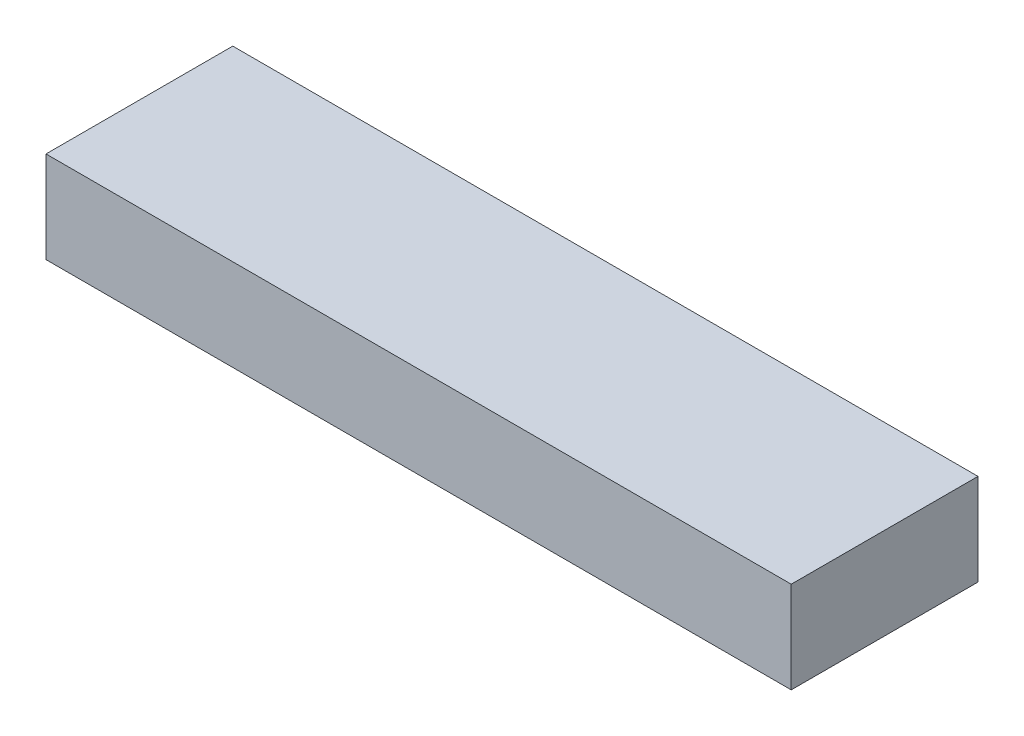
ISO-10303-21;
HEADER;
FILE_DESCRIPTION(('STEP AP214'),'2;1');
FILE_NAME('part.step','',(''),(''),'','','');
FILE_SCHEMA(('AUTOMOTIVE_DESIGN { 1 0 10303 214 1 1 1 1 }'));
ENDSEC;
DATA;
#1=APPLICATION_CONTEXT('core data for automotive mechanical design processes');
#2=APPLICATION_PROTOCOL_DEFINITION('international standard','automotive_design',2000,#1);
#3=PRODUCT_CONTEXT('',#1,'mechanical');
#4=PRODUCT('Part','Part','',(#3));
#5=PRODUCT_RELATED_PRODUCT_CATEGORY('part','',(#4));
#6=PRODUCT_DEFINITION_FORMATION('','',#4);
#7=PRODUCT_DEFINITION_CONTEXT('part definition',#1,'design');
#8=PRODUCT_DEFINITION('design','',#6,#7);
#9=PRODUCT_DEFINITION_SHAPE('','',#8);
#10=(LENGTH_UNIT() NAMED_UNIT(*) SI_UNIT(.MILLI.,.METRE.));
#11=(NAMED_UNIT(*) PLANE_ANGLE_UNIT() SI_UNIT($,.RADIAN.));
#12=(NAMED_UNIT(*) SI_UNIT($,.STERADIAN.) SOLID_ANGLE_UNIT());
#13=UNCERTAINTY_MEASURE_WITH_UNIT(LENGTH_MEASURE(1.E-05),#10,'distance_accuracy_value','');
#14=(GEOMETRIC_REPRESENTATION_CONTEXT(3) GLOBAL_UNCERTAINTY_ASSIGNED_CONTEXT((#13)) GLOBAL_UNIT_ASSIGNED_CONTEXT((#10,
#11,#12)) REPRESENTATION_CONTEXT('',''));
#15=CARTESIAN_POINT('',(0.,0.,0.));
#16=DIRECTION('',(0.,0.,1.));
#17=DIRECTION('',(1.,0.,0.));
#18=AXIS2_PLACEMENT_3D('',#15,#16,#17);
#19=CARTESIAN_POINT('',(8.89,0.,5.08));
#20=DIRECTION('',(0.,0.,-1.));
#21=DIRECTION('',(-1.,0.,0.));
#22=AXIS2_PLACEMENT_3D('',#19,#20,#21);
#23=PLANE('',#22);
#24=DIRECTION('',(0.,1.,0.));
#25=VECTOR('',#24,1.);
#26=CARTESIAN_POINT('',(-1.245,-1.245,5.08));
#27=LINE('',#26,#25);
#28=CARTESIAN_POINT('',(-1.245,-1.245,5.08));
#29=VERTEX_POINT('',#28);
#30=CARTESIAN_POINT('',(-1.245,1.245,5.08));
#31=VERTEX_POINT('',#30);
#32=EDGE_CURVE('E26',#29,#31,#27,.T.);
#33=ORIENTED_EDGE('',*,*,#32,.F.);
#34=DIRECTION('',(-1.,0.,0.));
#35=VECTOR('',#34,1.);
#36=CARTESIAN_POINT('',(19.025,-1.245,5.08));
#37=LINE('',#36,#35);
#38=CARTESIAN_POINT('',(19.025,-1.245,5.08));
#39=VERTEX_POINT('',#38);
#40=EDGE_CURVE('E55',#39,#29,#37,.T.);
#41=ORIENTED_EDGE('',*,*,#40,.F.);
#42=DIRECTION('',(0.,-1.,0.));
#43=VECTOR('',#42,1.);
#44=CARTESIAN_POINT('',(19.025,1.245,5.08));
#45=LINE('',#44,#43);
#46=CARTESIAN_POINT('',(19.025,1.245,5.08));
#47=VERTEX_POINT('',#46);
#48=EDGE_CURVE('E85',#47,#39,#45,.T.);
#49=ORIENTED_EDGE('',*,*,#48,.F.);
#50=DIRECTION('',(1.,0.,0.));
#51=VECTOR('',#50,1.);
#52=CARTESIAN_POINT('',(-1.245,1.245,5.08));
#53=LINE('',#52,#51);
#54=EDGE_CURVE('E83',#31,#47,#53,.T.);
#55=ORIENTED_EDGE('',*,*,#54,.F.);
#56=EDGE_LOOP('',(#33,#41,#49,#55));
#57=FACE_BOUND('',#56,.T.);
#58=ADVANCED_FACE('F16',(#57),#23,.F.);
#59=CARTESIAN_POINT('',(8.89,0.,0.));
#60=DIRECTION('',(0.,0.,-1.));
#61=DIRECTION('',(-1.,0.,0.));
#62=AXIS2_PLACEMENT_3D('',#59,#60,#61);
#63=PLANE('',#62);
#64=DIRECTION('',(1.,0.,0.));
#65=VECTOR('',#64,1.);
#66=CARTESIAN_POINT('',(-1.245,1.245,0.));
#67=LINE('',#66,#65);
#68=CARTESIAN_POINT('',(-1.245,1.245,0.));
#69=VERTEX_POINT('',#68);
#70=CARTESIAN_POINT('',(19.025,1.245,0.));
#71=VERTEX_POINT('',#70);
#72=EDGE_CURVE('E93',#69,#71,#67,.T.);
#73=ORIENTED_EDGE('',*,*,#72,.T.);
#74=DIRECTION('',(0.,-1.,0.));
#75=VECTOR('',#74,1.);
#76=CARTESIAN_POINT('',(19.025,1.245,0.));
#77=LINE('',#76,#75);
#78=CARTESIAN_POINT('',(19.025,-1.245,0.));
#79=VERTEX_POINT('',#78);
#80=EDGE_CURVE('E69',#71,#79,#77,.T.);
#81=ORIENTED_EDGE('',*,*,#80,.T.);
#82=DIRECTION('',(-1.,0.,0.));
#83=VECTOR('',#82,1.);
#84=CARTESIAN_POINT('',(19.025,-1.245,0.));
#85=LINE('',#84,#83);
#86=CARTESIAN_POINT('',(-1.245,-1.245,0.));
#87=VERTEX_POINT('',#86);
#88=EDGE_CURVE('E80',#79,#87,#85,.T.);
#89=ORIENTED_EDGE('',*,*,#88,.T.);
#90=DIRECTION('',(0.,1.,0.));
#91=VECTOR('',#90,1.);
#92=CARTESIAN_POINT('',(-1.245,-1.245,0.));
#93=LINE('',#92,#91);
#94=EDGE_CURVE('E11',#87,#69,#93,.T.);
#95=ORIENTED_EDGE('',*,*,#94,.T.);
#96=EDGE_LOOP('',(#73,#81,#89,#95));
#97=FACE_BOUND('',#96,.T.);
#98=ADVANCED_FACE('F187',(#97),#63,.T.);
#99=CARTESIAN_POINT('',(-1.245,-1.245,0.));
#100=DIRECTION('',(-1.,0.,0.));
#101=DIRECTION('',(0.,0.,1.));
#102=AXIS2_PLACEMENT_3D('',#99,#100,#101);
#103=PLANE('',#102);
#104=DIRECTION('',(0.,0.,1.));
#105=VECTOR('',#104,1.);
#106=CARTESIAN_POINT('',(-1.245,-1.245,0.));
#107=LINE('',#106,#105);
#108=EDGE_CURVE('E78',#87,#29,#107,.T.);
#109=ORIENTED_EDGE('',*,*,#108,.T.);
#110=ORIENTED_EDGE('',*,*,#32,.T.);
#111=DIRECTION('',(0.,0.,1.));
#112=VECTOR('',#111,1.);
#113=CARTESIAN_POINT('',(-1.245,1.245,0.));
#114=LINE('',#113,#112);
#115=EDGE_CURVE('E19',#69,#31,#114,.T.);
#116=ORIENTED_EDGE('',*,*,#115,.F.);
#117=ORIENTED_EDGE('',*,*,#94,.F.);
#118=EDGE_LOOP('',(#109,#110,#116,#117));
#119=FACE_BOUND('',#118,.T.);
#120=ADVANCED_FACE('F75',(#119),#103,.T.);
#121=CARTESIAN_POINT('',(19.025,-1.245,0.));
#122=DIRECTION('',(0.,-1.,0.));
#123=DIRECTION('',(0.,0.,-1.));
#124=AXIS2_PLACEMENT_3D('',#121,#122,#123);
#125=PLANE('',#124);
#126=DIRECTION('',(0.,0.,1.));
#127=VECTOR('',#126,1.);
#128=CARTESIAN_POINT('',(19.025,-1.245,0.));
#129=LINE('',#128,#127);
#130=EDGE_CURVE('E120',#79,#39,#129,.T.);
#131=ORIENTED_EDGE('',*,*,#130,.T.);
#132=ORIENTED_EDGE('',*,*,#40,.T.);
#133=ORIENTED_EDGE('',*,*,#108,.F.);
#134=ORIENTED_EDGE('',*,*,#88,.F.);
#135=EDGE_LOOP('',(#131,#132,#133,#134));
#136=FACE_BOUND('',#135,.T.);
#137=ADVANCED_FACE('F167',(#136),#125,.T.);
#138=CARTESIAN_POINT('',(19.025,1.245,0.));
#139=DIRECTION('',(1.,0.,0.));
#140=DIRECTION('',(0.,1.,0.));
#141=AXIS2_PLACEMENT_3D('',#138,#139,#140);
#142=PLANE('',#141);
#143=DIRECTION('',(0.,0.,1.));
#144=VECTOR('',#143,1.);
#145=CARTESIAN_POINT('',(19.025,1.245,0.));
#146=LINE('',#145,#144);
#147=EDGE_CURVE('E89',#71,#47,#146,.T.);
#148=ORIENTED_EDGE('',*,*,#147,.T.);
#149=ORIENTED_EDGE('',*,*,#48,.T.);
#150=ORIENTED_EDGE('',*,*,#130,.F.);
#151=ORIENTED_EDGE('',*,*,#80,.F.);
#152=EDGE_LOOP('',(#148,#149,#150,#151));
#153=FACE_BOUND('',#152,.T.);
#154=ADVANCED_FACE('F156',(#153),#142,.T.);
#155=CARTESIAN_POINT('',(-1.245,1.245,0.));
#156=DIRECTION('',(0.,1.,0.));
#157=DIRECTION('',(1.,0.,0.));
#158=AXIS2_PLACEMENT_3D('',#155,#156,#157);
#159=PLANE('',#158);
#160=ORIENTED_EDGE('',*,*,#115,.T.);
#161=ORIENTED_EDGE('',*,*,#54,.T.);
#162=ORIENTED_EDGE('',*,*,#147,.F.);
#163=ORIENTED_EDGE('',*,*,#72,.F.);
#164=EDGE_LOOP('',(#160,#161,#162,#163));
#165=FACE_BOUND('',#164,.T.);
#166=ADVANCED_FACE('F92',(#165),#159,.T.);
#167=CLOSED_SHELL('',(#58,#98,#120,#137,#154,#166));
#168=MANIFOLD_SOLID_BREP('B1',#167);
#169=ADVANCED_BREP_SHAPE_REPRESENTATION('',(#18,#168),#14);
#170=SHAPE_DEFINITION_REPRESENTATION(#9,#169);
ENDSEC;
END-ISO-10303-21;
